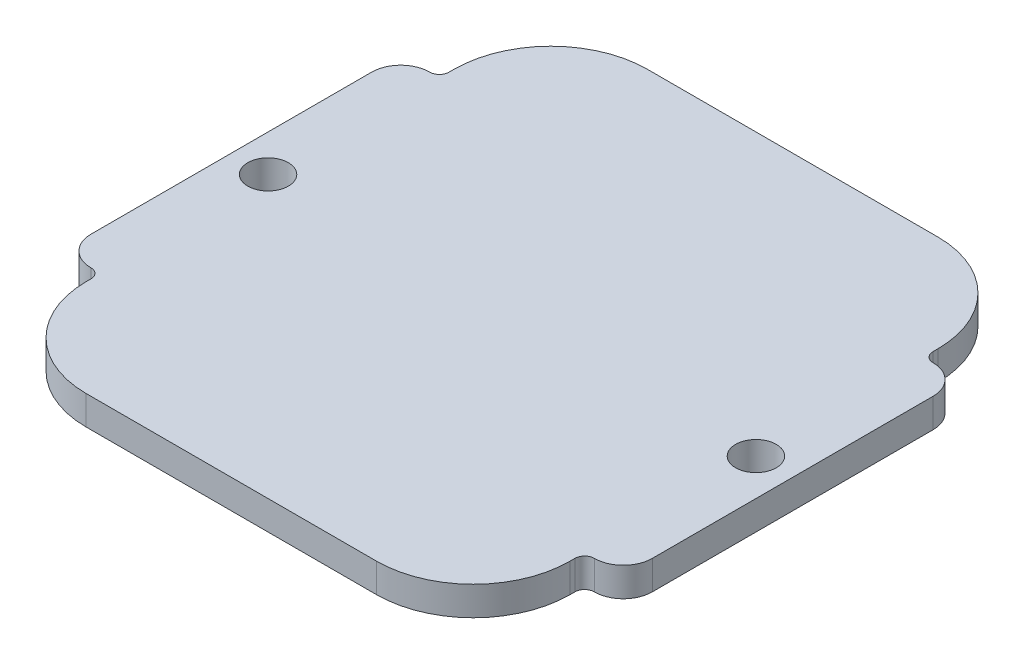
ISO-10303-21;
HEADER;
FILE_DESCRIPTION(('STEP AP214'),'2;1');
FILE_NAME('part.step','',(''),(''),'','','');
FILE_SCHEMA(('AUTOMOTIVE_DESIGN { 1 0 10303 214 1 1 1 1 }'));
ENDSEC;
DATA;
#1=APPLICATION_CONTEXT('core data for automotive mechanical design processes');
#2=APPLICATION_PROTOCOL_DEFINITION('international standard','automotive_design',2000,#1);
#3=PRODUCT_CONTEXT('',#1,'mechanical');
#4=PRODUCT('Part','Part','',(#3));
#5=PRODUCT_RELATED_PRODUCT_CATEGORY('part','',(#4));
#6=PRODUCT_DEFINITION_FORMATION('','',#4);
#7=PRODUCT_DEFINITION_CONTEXT('part definition',#1,'design');
#8=PRODUCT_DEFINITION('design','',#6,#7);
#9=PRODUCT_DEFINITION_SHAPE('','',#8);
#10=(LENGTH_UNIT() NAMED_UNIT(*) SI_UNIT(.MILLI.,.METRE.));
#11=(NAMED_UNIT(*) PLANE_ANGLE_UNIT() SI_UNIT($,.RADIAN.));
#12=(NAMED_UNIT(*) SI_UNIT($,.STERADIAN.) SOLID_ANGLE_UNIT());
#13=UNCERTAINTY_MEASURE_WITH_UNIT(LENGTH_MEASURE(1.E-05),#10,'distance_accuracy_value','');
#14=(GEOMETRIC_REPRESENTATION_CONTEXT(3) GLOBAL_UNCERTAINTY_ASSIGNED_CONTEXT((#13)) GLOBAL_UNIT_ASSIGNED_CONTEXT((#10,
#11,#12)) REPRESENTATION_CONTEXT('',''));
#15=CARTESIAN_POINT('',(0.,0.,0.));
#16=DIRECTION('',(0.,0.,1.));
#17=DIRECTION('',(1.,0.,0.));
#18=AXIS2_PLACEMENT_3D('',#15,#16,#17);
#19=CARTESIAN_POINT('',(28.9999999999999,3.,-17.4999999999996));
#20=DIRECTION('',(-1.,0.,0.));
#21=DIRECTION('',(0.,0.,1.));
#22=AXIS2_PLACEMENT_3D('',#19,#20,#21);
#23=PLANE('',#22);
#24=DIRECTION('',(0.,0.,-1.));
#25=VECTOR('',#24,1.);
#26=CARTESIAN_POINT('',(28.9999999999999,3.,-17.4999999999996));
#27=LINE('',#26,#25);
#28=CARTESIAN_POINT('',(28.9999999999999,3.,14.5000000000004));
#29=VERTEX_POINT('',#28);
#30=CARTESIAN_POINT('',(28.9999999999999,3.,-14.4999999999996));
#31=VERTEX_POINT('',#30);
#32=EDGE_CURVE('E214',#29,#31,#27,.T.);
#33=ORIENTED_EDGE('',*,*,#32,.F.);
#34=DIRECTION('',(0.,-1.,0.));
#35=VECTOR('',#34,1.);
#36=CARTESIAN_POINT('',(28.9999999999999,3.,14.5000000000004));
#37=LINE('',#36,#35);
#38=CARTESIAN_POINT('',(28.9999999999999,0.,14.5000000000004));
#39=VERTEX_POINT('',#38);
#40=EDGE_CURVE('E287',#29,#39,#37,.T.);
#41=ORIENTED_EDGE('',*,*,#40,.T.);
#42=DIRECTION('',(0.,0.,-1.));
#43=VECTOR('',#42,1.);
#44=CARTESIAN_POINT('',(28.9999999999999,0.,-17.4999999999996));
#45=LINE('',#44,#43);
#46=CARTESIAN_POINT('',(28.9999999999999,0.,-14.4999999999996));
#47=VERTEX_POINT('',#46);
#48=EDGE_CURVE('E201',#39,#47,#45,.T.);
#49=ORIENTED_EDGE('',*,*,#48,.T.);
#50=DIRECTION('',(0.,-1.,0.));
#51=VECTOR('',#50,1.);
#52=CARTESIAN_POINT('',(28.9999999999999,3.,-14.4999999999996));
#53=LINE('',#52,#51);
#54=EDGE_CURVE('E285',#47,#31,#53,.F.);
#55=ORIENTED_EDGE('',*,*,#54,.T.);
#56=EDGE_LOOP('',(#33,#41,#49,#55));
#57=FACE_BOUND('',#56,.T.);
#58=ADVANCED_FACE('F32',(#57),#23,.F.);
#59=CARTESIAN_POINT('',(24.9999999999999,3.,-17.4999999999996));
#60=DIRECTION('',(-1.,0.,0.));
#61=DIRECTION('',(0.,0.,1.));
#62=AXIS2_PLACEMENT_3D('',#59,#60,#61);
#63=PLANE('',#62);
#64=DIRECTION('',(0.,0.,-1.));
#65=VECTOR('',#64,1.);
#66=CARTESIAN_POINT('',(24.9999999999999,3.,-17.4999999999996));
#67=LINE('',#66,#65);
#68=CARTESIAN_POINT('',(24.9999999999999,3.,-18.4999999999996));
#69=VERTEX_POINT('',#68);
#70=CARTESIAN_POINT('',(24.9999999999999,3.,-18.9999999999995));
#71=VERTEX_POINT('',#70);
#72=EDGE_CURVE('E363',#69,#71,#67,.T.);
#73=ORIENTED_EDGE('',*,*,#72,.F.);
#74=DIRECTION('',(0.,-1.,0.));
#75=VECTOR('',#74,1.);
#76=CARTESIAN_POINT('',(24.9999999999999,0.,-18.4999999999996));
#77=LINE('',#76,#75);
#78=CARTESIAN_POINT('',(24.9999999999999,0.,-18.4999999999996));
#79=VERTEX_POINT('',#78);
#80=EDGE_CURVE('E256',#69,#79,#77,.T.);
#81=ORIENTED_EDGE('',*,*,#80,.T.);
#82=DIRECTION('',(0.,0.,-1.));
#83=VECTOR('',#82,1.);
#84=CARTESIAN_POINT('',(24.9999999999999,0.,-17.4999999999996));
#85=LINE('',#84,#83);
#86=CARTESIAN_POINT('',(24.9999999999999,0.,-18.9999999999995));
#87=VERTEX_POINT('',#86);
#88=EDGE_CURVE('E196',#79,#87,#85,.T.);
#89=ORIENTED_EDGE('',*,*,#88,.T.);
#90=DIRECTION('',(0.,-1.,0.));
#91=VECTOR('',#90,1.);
#92=CARTESIAN_POINT('',(24.9999999999999,3.,-18.9999999999995));
#93=LINE('',#92,#91);
#94=EDGE_CURVE('E175',#87,#71,#93,.F.);
#95=ORIENTED_EDGE('',*,*,#94,.T.);
#96=EDGE_LOOP('',(#73,#81,#89,#95));
#97=FACE_BOUND('',#96,.T.);
#98=ADVANCED_FACE('F388',(#97),#63,.F.);
#99=CARTESIAN_POINT('',(-24.9999999999999,3.,-28.9999999999995));
#100=DIRECTION('',(0.,0.,1.));
#101=DIRECTION('',(1.,0.,0.));
#102=AXIS2_PLACEMENT_3D('',#99,#100,#101);
#103=PLANE('',#102);
#104=DIRECTION('',(-1.,0.,0.));
#105=VECTOR('',#104,1.);
#106=CARTESIAN_POINT('',(-24.9999999999999,3.,-28.9999999999995));
#107=LINE('',#106,#105);
#108=CARTESIAN_POINT('',(14.9999999999999,3.,-28.9999999999995));
#109=VERTEX_POINT('',#108);
#110=CARTESIAN_POINT('',(-15.0000000000001,3.,-28.9999999999995));
#111=VERTEX_POINT('',#110);
#112=EDGE_CURVE('E188',#109,#111,#107,.T.);
#113=ORIENTED_EDGE('',*,*,#112,.F.);
#114=DIRECTION('',(0.,-1.,0.));
#115=VECTOR('',#114,1.);
#116=CARTESIAN_POINT('',(14.9999999999999,3.,-28.9999999999995));
#117=LINE('',#116,#115);
#118=CARTESIAN_POINT('',(14.9999999999999,0.,-28.9999999999995));
#119=VERTEX_POINT('',#118);
#120=EDGE_CURVE('E173',#109,#119,#117,.T.);
#121=ORIENTED_EDGE('',*,*,#120,.T.);
#122=DIRECTION('',(-1.,0.,0.));
#123=VECTOR('',#122,1.);
#124=CARTESIAN_POINT('',(-24.9999999999999,0.,-28.9999999999995));
#125=LINE('',#124,#123);
#126=CARTESIAN_POINT('',(-15.0000000000001,0.,-28.9999999999995));
#127=VERTEX_POINT('',#126);
#128=EDGE_CURVE('E185',#119,#127,#125,.T.);
#129=ORIENTED_EDGE('',*,*,#128,.T.);
#130=DIRECTION('',(0.,-1.,0.));
#131=VECTOR('',#130,1.);
#132=CARTESIAN_POINT('',(-15.0000000000001,3.,-28.9999999999995));
#133=LINE('',#132,#131);
#134=EDGE_CURVE('E190',#127,#111,#133,.F.);
#135=ORIENTED_EDGE('',*,*,#134,.T.);
#136=EDGE_LOOP('',(#113,#121,#129,#135));
#137=FACE_BOUND('',#136,.T.);
#138=ADVANCED_FACE('F184',(#137),#103,.F.);
#139=CARTESIAN_POINT('',(-25.0000000000001,3.,-17.4999999999995));
#140=DIRECTION('',(1.,0.,0.));
#141=DIRECTION('',(0.,0.,-1.));
#142=AXIS2_PLACEMENT_3D('',#139,#140,#141);
#143=PLANE('',#142);
#144=DIRECTION('',(0.,0.,1.));
#145=VECTOR('',#144,1.);
#146=CARTESIAN_POINT('',(-25.0000000000001,0.,-17.4999999999995));
#147=LINE('',#146,#145);
#148=CARTESIAN_POINT('',(-25.0000000000001,0.,-18.9999999999997));
#149=VERTEX_POINT('',#148);
#150=CARTESIAN_POINT('',(-25.0000000000001,0.,-18.4999999999995));
#151=VERTEX_POINT('',#150);
#152=EDGE_CURVE('E195',#149,#151,#147,.T.);
#153=ORIENTED_EDGE('',*,*,#152,.T.);
#154=DIRECTION('',(0.,-1.,0.));
#155=VECTOR('',#154,1.);
#156=CARTESIAN_POINT('',(-25.0000000000001,3.,-18.4999999999995));
#157=LINE('',#156,#155);
#158=CARTESIAN_POINT('',(-25.0000000000001,3.,-18.4999999999995));
#159=VERTEX_POINT('',#158);
#160=EDGE_CURVE('E265',#151,#159,#157,.F.);
#161=ORIENTED_EDGE('',*,*,#160,.T.);
#162=DIRECTION('',(0.,0.,1.));
#163=VECTOR('',#162,1.);
#164=CARTESIAN_POINT('',(-25.0000000000001,3.,-17.4999999999995));
#165=LINE('',#164,#163);
#166=CARTESIAN_POINT('',(-25.0000000000001,3.,-18.9999999999997));
#167=VERTEX_POINT('',#166);
#168=EDGE_CURVE('E366',#167,#159,#165,.T.);
#169=ORIENTED_EDGE('',*,*,#168,.F.);
#170=DIRECTION('',(0.,-1.,0.));
#171=VECTOR('',#170,1.);
#172=CARTESIAN_POINT('',(-25.0000000000001,3.,-18.9999999999997));
#173=LINE('',#172,#171);
#174=EDGE_CURVE('E242',#167,#149,#173,.T.);
#175=ORIENTED_EDGE('',*,*,#174,.T.);
#176=EDGE_LOOP('',(#153,#161,#169,#175));
#177=FACE_BOUND('',#176,.T.);
#178=ADVANCED_FACE('F461',(#177),#143,.F.);
#179=CARTESIAN_POINT('',(-29.0000000000001,3.,-17.4999999999995));
#180=DIRECTION('',(1.,0.,0.));
#181=DIRECTION('',(0.,0.,-1.));
#182=AXIS2_PLACEMENT_3D('',#179,#180,#181);
#183=PLANE('',#182);
#184=DIRECTION('',(0.,0.,1.));
#185=VECTOR('',#184,1.);
#186=CARTESIAN_POINT('',(-29.0000000000001,0.,-17.4999999999995));
#187=LINE('',#186,#185);
#188=CARTESIAN_POINT('',(-29.0000000000001,0.,-14.4999999999995));
#189=VERTEX_POINT('',#188);
#190=CARTESIAN_POINT('',(-29.0000000000001,0.,14.5000000000005));
#191=VERTEX_POINT('',#190);
#192=EDGE_CURVE('E199',#189,#191,#187,.T.);
#193=ORIENTED_EDGE('',*,*,#192,.T.);
#194=DIRECTION('',(0.,-1.,0.));
#195=VECTOR('',#194,1.);
#196=CARTESIAN_POINT('',(-29.0000000000001,3.,14.5000000000005));
#197=LINE('',#196,#195);
#198=CARTESIAN_POINT('',(-29.0000000000001,3.,14.5000000000005));
#199=VERTEX_POINT('',#198);
#200=EDGE_CURVE('E11',#191,#199,#197,.F.);
#201=ORIENTED_EDGE('',*,*,#200,.T.);
#202=DIRECTION('',(0.,0.,1.));
#203=VECTOR('',#202,1.);
#204=CARTESIAN_POINT('',(-29.0000000000001,3.,-17.4999999999995));
#205=LINE('',#204,#203);
#206=CARTESIAN_POINT('',(-29.0000000000001,3.,-14.4999999999995));
#207=VERTEX_POINT('',#206);
#208=EDGE_CURVE('E308',#207,#199,#205,.T.);
#209=ORIENTED_EDGE('',*,*,#208,.F.);
#210=DIRECTION('',(0.,-1.,0.));
#211=VECTOR('',#210,1.);
#212=CARTESIAN_POINT('',(-29.0000000000001,3.,-14.4999999999995));
#213=LINE('',#212,#211);
#214=EDGE_CURVE('E40',#207,#189,#213,.T.);
#215=ORIENTED_EDGE('',*,*,#214,.T.);
#216=EDGE_LOOP('',(#193,#201,#209,#215));
#217=FACE_BOUND('',#216,.T.);
#218=ADVANCED_FACE('F307',(#217),#183,.F.);
#219=CARTESIAN_POINT('',(-25.0000000000001,3.,17.5000000000005));
#220=DIRECTION('',(1.,0.,0.));
#221=DIRECTION('',(0.,0.,-1.));
#222=AXIS2_PLACEMENT_3D('',#219,#220,#221);
#223=PLANE('',#222);
#224=DIRECTION('',(0.,0.,1.));
#225=VECTOR('',#224,1.);
#226=CARTESIAN_POINT('',(-25.0000000000001,3.,17.5000000000005));
#227=LINE('',#226,#225);
#228=CARTESIAN_POINT('',(-25.0000000000001,3.,18.5000000000004));
#229=VERTEX_POINT('',#228);
#230=CARTESIAN_POINT('',(-25.0000000000001,3.,19.0000000000006));
#231=VERTEX_POINT('',#230);
#232=EDGE_CURVE('E324',#229,#231,#227,.T.);
#233=ORIENTED_EDGE('',*,*,#232,.F.);
#234=DIRECTION('',(0.,-1.,0.));
#235=VECTOR('',#234,1.);
#236=CARTESIAN_POINT('',(-25.0000000000001,0.,18.5000000000004));
#237=LINE('',#236,#235);
#238=CARTESIAN_POINT('',(-25.0000000000001,0.,18.5000000000004));
#239=VERTEX_POINT('',#238);
#240=EDGE_CURVE('E245',#229,#239,#237,.T.);
#241=ORIENTED_EDGE('',*,*,#240,.T.);
#242=DIRECTION('',(0.,0.,1.));
#243=VECTOR('',#242,1.);
#244=CARTESIAN_POINT('',(-25.0000000000001,0.,17.5000000000005));
#245=LINE('',#244,#243);
#246=CARTESIAN_POINT('',(-25.0000000000001,0.,19.0000000000006));
#247=VERTEX_POINT('',#246);
#248=EDGE_CURVE('E206',#239,#247,#245,.T.);
#249=ORIENTED_EDGE('',*,*,#248,.T.);
#250=DIRECTION('',(0.,-1.,0.));
#251=VECTOR('',#250,1.);
#252=CARTESIAN_POINT('',(-25.0000000000001,3.,19.0000000000006));
#253=LINE('',#252,#251);
#254=EDGE_CURVE('E239',#247,#231,#253,.F.);
#255=ORIENTED_EDGE('',*,*,#254,.T.);
#256=EDGE_LOOP('',(#233,#241,#249,#255));
#257=FACE_BOUND('',#256,.T.);
#258=ADVANCED_FACE('F323',(#257),#223,.F.);
#259=CARTESIAN_POINT('',(-24.9999999999999,3.,29.0000000000004));
#260=DIRECTION('',(0.,0.,-1.));
#261=DIRECTION('',(-1.,0.,0.));
#262=AXIS2_PLACEMENT_3D('',#259,#260,#261);
#263=PLANE('',#262);
#264=DIRECTION('',(1.,0.,0.));
#265=VECTOR('',#264,1.);
#266=CARTESIAN_POINT('',(-24.9999999999999,0.,29.0000000000004));
#267=LINE('',#266,#265);
#268=CARTESIAN_POINT('',(-15.0000000000001,0.,29.0000000000004));
#269=VERTEX_POINT('',#268);
#270=CARTESIAN_POINT('',(14.9999999999999,0.,29.0000000000005));
#271=VERTEX_POINT('',#270);
#272=EDGE_CURVE('E208',#269,#271,#267,.T.);
#273=ORIENTED_EDGE('',*,*,#272,.T.);
#274=DIRECTION('',(0.,-1.,0.));
#275=VECTOR('',#274,1.);
#276=CARTESIAN_POINT('',(14.9999999999999,3.,29.0000000000005));
#277=LINE('',#276,#275);
#278=CARTESIAN_POINT('',(14.9999999999999,3.,29.0000000000005));
#279=VERTEX_POINT('',#278);
#280=EDGE_CURVE('E237',#271,#279,#277,.F.);
#281=ORIENTED_EDGE('',*,*,#280,.T.);
#282=DIRECTION('',(1.,0.,0.));
#283=VECTOR('',#282,1.);
#284=CARTESIAN_POINT('',(-24.9999999999999,3.,29.0000000000004));
#285=LINE('',#284,#283);
#286=CARTESIAN_POINT('',(-15.0000000000001,3.,29.0000000000004));
#287=VERTEX_POINT('',#286);
#288=EDGE_CURVE('E333',#287,#279,#285,.T.);
#289=ORIENTED_EDGE('',*,*,#288,.F.);
#290=DIRECTION('',(0.,-1.,0.));
#291=VECTOR('',#290,1.);
#292=CARTESIAN_POINT('',(-15.0000000000001,3.,29.0000000000004));
#293=LINE('',#292,#291);
#294=EDGE_CURVE('E234',#287,#269,#293,.T.);
#295=ORIENTED_EDGE('',*,*,#294,.T.);
#296=EDGE_LOOP('',(#273,#281,#289,#295));
#297=FACE_BOUND('',#296,.T.);
#298=ADVANCED_FACE('F336',(#297),#263,.F.);
#299=CARTESIAN_POINT('',(24.9999999999999,3.,17.5000000000005));
#300=DIRECTION('',(-1.,0.,0.));
#301=DIRECTION('',(0.,0.,1.));
#302=AXIS2_PLACEMENT_3D('',#299,#300,#301);
#303=PLANE('',#302);
#304=DIRECTION('',(0.,0.,-1.));
#305=VECTOR('',#304,1.);
#306=CARTESIAN_POINT('',(24.9999999999999,0.,17.5000000000005));
#307=LINE('',#306,#305);
#308=CARTESIAN_POINT('',(24.9999999999999,0.,19.0000000000004));
#309=VERTEX_POINT('',#308);
#310=CARTESIAN_POINT('',(24.9999999999999,0.,18.5000000000005));
#311=VERTEX_POINT('',#310);
#312=EDGE_CURVE('E211',#309,#311,#307,.T.);
#313=ORIENTED_EDGE('',*,*,#312,.T.);
#314=DIRECTION('',(0.,-1.,0.));
#315=VECTOR('',#314,1.);
#316=CARTESIAN_POINT('',(24.9999999999999,3.,18.5000000000005));
#317=LINE('',#316,#315);
#318=CARTESIAN_POINT('',(24.9999999999999,3.,18.5000000000005));
#319=VERTEX_POINT('',#318);
#320=EDGE_CURVE('E254',#311,#319,#317,.F.);
#321=ORIENTED_EDGE('',*,*,#320,.T.);
#322=DIRECTION('',(0.,0.,-1.));
#323=VECTOR('',#322,1.);
#324=CARTESIAN_POINT('',(24.9999999999999,3.,17.5000000000005));
#325=LINE('',#324,#323);
#326=CARTESIAN_POINT('',(24.9999999999999,3.,19.0000000000004));
#327=VERTEX_POINT('',#326);
#328=EDGE_CURVE('E215',#327,#319,#325,.T.);
#329=ORIENTED_EDGE('',*,*,#328,.F.);
#330=DIRECTION('',(0.,-1.,0.));
#331=VECTOR('',#330,1.);
#332=CARTESIAN_POINT('',(24.9999999999999,3.,19.0000000000004));
#333=LINE('',#332,#331);
#334=EDGE_CURVE('E231',#327,#309,#333,.T.);
#335=ORIENTED_EDGE('',*,*,#334,.T.);
#336=EDGE_LOOP('',(#313,#321,#329,#335));
#337=FACE_BOUND('',#336,.T.);
#338=ADVANCED_FACE('F445',(#337),#303,.F.);
#339=CARTESIAN_POINT('',(0.,3.,0.));
#340=DIRECTION('',(0.,-1.,0.));
#341=DIRECTION('',(0.,0.,-1.));
#342=AXIS2_PLACEMENT_3D('',#339,#340,#341);
#343=PLANE('',#342);
#344=CARTESIAN_POINT('',(-25.2000000000001,3.,0.));
#345=DIRECTION('',(0.,1.,0.));
#346=DIRECTION('',(0.,0.,1.));
#347=AXIS2_PLACEMENT_3D('',#344,#345,#346);
#348=CIRCLE('',#347,2.1);
#349=CARTESIAN_POINT('',(-25.2000000000001,3.,2.1));
#350=VERTEX_POINT('',#349);
#351=EDGE_CURVE('E348',#350,#350,#348,.T.);
#352=ORIENTED_EDGE('',*,*,#351,.F.);
#353=EDGE_LOOP('',(#352));
#354=FACE_BOUND('',#353,.T.);
#355=CARTESIAN_POINT('',(25.1999999999999,3.,0.));
#356=DIRECTION('',(0.,1.,0.));
#357=DIRECTION('',(0.,0.,1.));
#358=AXIS2_PLACEMENT_3D('',#355,#356,#357);
#359=CIRCLE('',#358,2.1);
#360=CARTESIAN_POINT('',(25.1999999999999,3.,2.1));
#361=VERTEX_POINT('',#360);
#362=EDGE_CURVE('E358',#361,#361,#359,.T.);
#363=ORIENTED_EDGE('',*,*,#362,.F.);
#364=EDGE_LOOP('',(#363));
#365=FACE_BOUND('',#364,.T.);
#366=CARTESIAN_POINT('',(25.9999999999999,3.,18.5000000000005));
#367=DIRECTION('',(0.,-1.,0.));
#368=DIRECTION('',(0.,0.,-1.));
#369=AXIS2_PLACEMENT_3D('',#366,#367,#368);
#370=CIRCLE('',#369,1.);
#371=CARTESIAN_POINT('',(25.9999999999999,3.,17.5000000000005));
#372=VERTEX_POINT('',#371);
#373=EDGE_CURVE('E274',#319,#372,#370,.T.);
#374=ORIENTED_EDGE('',*,*,#373,.T.);
#375=CARTESIAN_POINT('',(25.9999999999999,3.,14.5000000000004));
#376=DIRECTION('',(0.,-1.,0.));
#377=DIRECTION('',(0.,0.,-1.));
#378=AXIS2_PLACEMENT_3D('',#375,#376,#377);
#379=CIRCLE('',#378,3.);
#380=EDGE_CURVE('E303',#372,#29,#379,.F.);
#381=ORIENTED_EDGE('',*,*,#380,.T.);
#382=ORIENTED_EDGE('',*,*,#32,.T.);
#383=CARTESIAN_POINT('',(25.9999999999999,3.,-14.4999999999996));
#384=DIRECTION('',(0.,-1.,0.));
#385=DIRECTION('',(0.,0.,-1.));
#386=AXIS2_PLACEMENT_3D('',#383,#384,#385);
#387=CIRCLE('',#386,3.);
#388=CARTESIAN_POINT('',(25.9999999999999,3.,-17.4999999999996));
#389=VERTEX_POINT('',#388);
#390=EDGE_CURVE('E301',#31,#389,#387,.F.);
#391=ORIENTED_EDGE('',*,*,#390,.T.);
#392=CARTESIAN_POINT('',(25.9999999999999,3.,-18.4999999999996));
#393=DIRECTION('',(0.,-1.,0.));
#394=DIRECTION('',(0.,0.,-1.));
#395=AXIS2_PLACEMENT_3D('',#392,#393,#394);
#396=CIRCLE('',#395,1.);
#397=EDGE_CURVE('E279',#389,#69,#396,.T.);
#398=ORIENTED_EDGE('',*,*,#397,.T.);
#399=ORIENTED_EDGE('',*,*,#72,.T.);
#400=CARTESIAN_POINT('',(14.9999999999999,3.,-18.9999999999995));
#401=DIRECTION('',(0.,-1.,0.));
#402=DIRECTION('',(0.,0.,-1.));
#403=AXIS2_PLACEMENT_3D('',#400,#401,#402);
#404=CIRCLE('',#403,10.);
#405=EDGE_CURVE('E229',#71,#109,#404,.F.);
#406=ORIENTED_EDGE('',*,*,#405,.T.);
#407=ORIENTED_EDGE('',*,*,#112,.T.);
#408=CARTESIAN_POINT('',(-15.0000000000001,3.,-18.9999999999995));
#409=DIRECTION('',(0.,-1.,0.));
#410=DIRECTION('',(0.,0.,-1.));
#411=AXIS2_PLACEMENT_3D('',#408,#409,#410);
#412=CIRCLE('',#411,10.);
#413=EDGE_CURVE('E223',#111,#167,#412,.F.);
#414=ORIENTED_EDGE('',*,*,#413,.T.);
#415=ORIENTED_EDGE('',*,*,#168,.T.);
#416=CARTESIAN_POINT('',(-26.0000000000001,3.,-18.4999999999995));
#417=DIRECTION('',(0.,-1.,0.));
#418=DIRECTION('',(0.,0.,-1.));
#419=AXIS2_PLACEMENT_3D('',#416,#417,#418);
#420=CIRCLE('',#419,1.);
#421=CARTESIAN_POINT('',(-26.0000000000001,3.,-17.4999999999995));
#422=VERTEX_POINT('',#421);
#423=EDGE_CURVE('E283',#159,#422,#420,.T.);
#424=ORIENTED_EDGE('',*,*,#423,.T.);
#425=CARTESIAN_POINT('',(-26.0000000000001,3.,-14.4999999999995));
#426=DIRECTION('',(0.,-1.,0.));
#427=DIRECTION('',(0.,0.,-1.));
#428=AXIS2_PLACEMENT_3D('',#425,#426,#427);
#429=CIRCLE('',#428,3.);
#430=EDGE_CURVE('E52',#422,#207,#429,.F.);
#431=ORIENTED_EDGE('',*,*,#430,.T.);
#432=ORIENTED_EDGE('',*,*,#208,.T.);
#433=CARTESIAN_POINT('',(-26.0000000000001,3.,14.5000000000005));
#434=DIRECTION('',(0.,-1.,0.));
#435=DIRECTION('',(0.,0.,-1.));
#436=AXIS2_PLACEMENT_3D('',#433,#434,#435);
#437=CIRCLE('',#436,3.);
#438=CARTESIAN_POINT('',(-26.0000000000001,3.,17.5000000000005));
#439=VERTEX_POINT('',#438);
#440=EDGE_CURVE('E299',#199,#439,#437,.F.);
#441=ORIENTED_EDGE('',*,*,#440,.T.);
#442=CARTESIAN_POINT('',(-26.0000000000001,3.,18.5000000000005));
#443=DIRECTION('',(0.,-1.,0.));
#444=DIRECTION('',(0.,0.,-1.));
#445=AXIS2_PLACEMENT_3D('',#442,#443,#444);
#446=CIRCLE('',#445,1.);
#447=EDGE_CURVE('E270',#439,#229,#446,.T.);
#448=ORIENTED_EDGE('',*,*,#447,.T.);
#449=ORIENTED_EDGE('',*,*,#232,.T.);
#450=CARTESIAN_POINT('',(-15.0000000000001,3.,19.0000000000004));
#451=DIRECTION('',(0.,-1.,0.));
#452=DIRECTION('',(0.,0.,-1.));
#453=AXIS2_PLACEMENT_3D('',#450,#451,#452);
#454=CIRCLE('',#453,10.);
#455=EDGE_CURVE('E225',#231,#287,#454,.F.);
#456=ORIENTED_EDGE('',*,*,#455,.T.);
#457=ORIENTED_EDGE('',*,*,#288,.T.);
#458=CARTESIAN_POINT('',(14.9999999999999,3.,19.0000000000005));
#459=DIRECTION('',(0.,-1.,0.));
#460=DIRECTION('',(0.,0.,-1.));
#461=AXIS2_PLACEMENT_3D('',#458,#459,#460);
#462=CIRCLE('',#461,10.);
#463=EDGE_CURVE('E227',#279,#327,#462,.F.);
#464=ORIENTED_EDGE('',*,*,#463,.T.);
#465=ORIENTED_EDGE('',*,*,#328,.T.);
#466=EDGE_LOOP('',(#374,#381,#382,#391,#398,#399,#406,#407,#414,#415,#424,#431,#432,#441,#448,
#449,#456,#457,#464,#465));
#467=FACE_BOUND('',#466,.T.);
#468=ADVANCED_FACE('F317',(#354,#365,#467),#343,.F.);
#469=CARTESIAN_POINT('',(0.,0.,0.));
#470=DIRECTION('',(0.,-1.,0.));
#471=DIRECTION('',(0.,0.,-1.));
#472=AXIS2_PLACEMENT_3D('',#469,#470,#471);
#473=PLANE('',#472);
#474=CARTESIAN_POINT('',(-25.2000000000001,0.,0.));
#475=DIRECTION('',(0.,1.,0.));
#476=DIRECTION('',(0.,0.,1.));
#477=AXIS2_PLACEMENT_3D('',#474,#475,#476);
#478=CIRCLE('',#477,2.1);
#479=CARTESIAN_POINT('',(-25.2000000000001,0.,2.1));
#480=VERTEX_POINT('',#479);
#481=EDGE_CURVE('E344',#480,#480,#478,.T.);
#482=ORIENTED_EDGE('',*,*,#481,.T.);
#483=EDGE_LOOP('',(#482));
#484=FACE_BOUND('',#483,.T.);
#485=CARTESIAN_POINT('',(25.1999999999999,0.,0.));
#486=DIRECTION('',(0.,1.,0.));
#487=DIRECTION('',(0.,0.,1.));
#488=AXIS2_PLACEMENT_3D('',#485,#486,#487);
#489=CIRCLE('',#488,2.1);
#490=CARTESIAN_POINT('',(25.1999999999999,0.,2.1));
#491=VERTEX_POINT('',#490);
#492=EDGE_CURVE('E353',#491,#491,#489,.T.);
#493=ORIENTED_EDGE('',*,*,#492,.T.);
#494=EDGE_LOOP('',(#493));
#495=FACE_BOUND('',#494,.T.);
#496=ORIENTED_EDGE('',*,*,#48,.F.);
#497=CARTESIAN_POINT('',(25.9999999999999,0.,14.5000000000004));
#498=DIRECTION('',(0.,-1.,0.));
#499=DIRECTION('',(0.,0.,-1.));
#500=AXIS2_PLACEMENT_3D('',#497,#498,#499);
#501=CIRCLE('',#500,3.);
#502=CARTESIAN_POINT('',(25.9999999999999,0.,17.5000000000005));
#503=VERTEX_POINT('',#502);
#504=EDGE_CURVE('E296',#39,#503,#501,.T.);
#505=ORIENTED_EDGE('',*,*,#504,.T.);
#506=CARTESIAN_POINT('',(25.9999999999999,0.,18.5000000000005));
#507=DIRECTION('',(0.,-1.,0.));
#508=DIRECTION('',(0.,0.,-1.));
#509=AXIS2_PLACEMENT_3D('',#506,#507,#508);
#510=CIRCLE('',#509,1.);
#511=EDGE_CURVE('E272',#503,#311,#510,.F.);
#512=ORIENTED_EDGE('',*,*,#511,.T.);
#513=ORIENTED_EDGE('',*,*,#312,.F.);
#514=CARTESIAN_POINT('',(14.9999999999999,0.,19.0000000000005));
#515=DIRECTION('',(0.,-1.,0.));
#516=DIRECTION('',(0.,0.,-1.));
#517=AXIS2_PLACEMENT_3D('',#514,#515,#516);
#518=CIRCLE('',#517,10.);
#519=EDGE_CURVE('E179',#309,#271,#518,.T.);
#520=ORIENTED_EDGE('',*,*,#519,.T.);
#521=ORIENTED_EDGE('',*,*,#272,.F.);
#522=CARTESIAN_POINT('',(-15.0000000000001,0.,19.0000000000004));
#523=DIRECTION('',(0.,-1.,0.));
#524=DIRECTION('',(0.,0.,-1.));
#525=AXIS2_PLACEMENT_3D('',#522,#523,#524);
#526=CIRCLE('',#525,10.);
#527=EDGE_CURVE('E218',#269,#247,#526,.T.);
#528=ORIENTED_EDGE('',*,*,#527,.T.);
#529=ORIENTED_EDGE('',*,*,#248,.F.);
#530=CARTESIAN_POINT('',(-26.0000000000001,0.,18.5000000000005));
#531=DIRECTION('',(0.,-1.,0.));
#532=DIRECTION('',(0.,0.,-1.));
#533=AXIS2_PLACEMENT_3D('',#530,#531,#532);
#534=CIRCLE('',#533,1.);
#535=CARTESIAN_POINT('',(-26.0000000000001,0.,17.5000000000005));
#536=VERTEX_POINT('',#535);
#537=EDGE_CURVE('E267',#239,#536,#534,.F.);
#538=ORIENTED_EDGE('',*,*,#537,.T.);
#539=CARTESIAN_POINT('',(-26.0000000000001,0.,14.5000000000005));
#540=DIRECTION('',(0.,-1.,0.));
#541=DIRECTION('',(0.,0.,-1.));
#542=AXIS2_PLACEMENT_3D('',#539,#540,#541);
#543=CIRCLE('',#542,3.);
#544=EDGE_CURVE('E292',#536,#191,#543,.T.);
#545=ORIENTED_EDGE('',*,*,#544,.T.);
#546=ORIENTED_EDGE('',*,*,#192,.F.);
#547=CARTESIAN_POINT('',(-26.0000000000001,0.,-14.4999999999995));
#548=DIRECTION('',(0.,-1.,0.));
#549=DIRECTION('',(0.,0.,-1.));
#550=AXIS2_PLACEMENT_3D('',#547,#548,#549);
#551=CIRCLE('',#550,3.);
#552=CARTESIAN_POINT('',(-26.0000000000001,0.,-17.4999999999995));
#553=VERTEX_POINT('',#552);
#554=EDGE_CURVE('E290',#189,#553,#551,.T.);
#555=ORIENTED_EDGE('',*,*,#554,.T.);
#556=CARTESIAN_POINT('',(-26.0000000000001,0.,-18.4999999999995));
#557=DIRECTION('',(0.,-1.,0.));
#558=DIRECTION('',(0.,0.,-1.));
#559=AXIS2_PLACEMENT_3D('',#556,#557,#558);
#560=CIRCLE('',#559,1.);
#561=EDGE_CURVE('E281',#553,#151,#560,.F.);
#562=ORIENTED_EDGE('',*,*,#561,.T.);
#563=ORIENTED_EDGE('',*,*,#152,.F.);
#564=CARTESIAN_POINT('',(-15.0000000000001,0.,-18.9999999999995));
#565=DIRECTION('',(0.,-1.,0.));
#566=DIRECTION('',(0.,0.,-1.));
#567=AXIS2_PLACEMENT_3D('',#564,#565,#566);
#568=CIRCLE('',#567,10.);
#569=EDGE_CURVE('E189',#149,#127,#568,.T.);
#570=ORIENTED_EDGE('',*,*,#569,.T.);
#571=ORIENTED_EDGE('',*,*,#128,.F.);
#572=CARTESIAN_POINT('',(14.9999999999999,0.,-18.9999999999995));
#573=DIRECTION('',(0.,-1.,0.));
#574=DIRECTION('',(0.,0.,-1.));
#575=AXIS2_PLACEMENT_3D('',#572,#573,#574);
#576=CIRCLE('',#575,10.);
#577=EDGE_CURVE('E169',#119,#87,#576,.T.);
#578=ORIENTED_EDGE('',*,*,#577,.T.);
#579=ORIENTED_EDGE('',*,*,#88,.F.);
#580=CARTESIAN_POINT('',(25.9999999999999,0.,-18.4999999999996));
#581=DIRECTION('',(0.,-1.,0.));
#582=DIRECTION('',(0.,0.,-1.));
#583=AXIS2_PLACEMENT_3D('',#580,#581,#582);
#584=CIRCLE('',#583,1.);
#585=CARTESIAN_POINT('',(25.9999999999999,0.,-17.4999999999996));
#586=VERTEX_POINT('',#585);
#587=EDGE_CURVE('E276',#79,#586,#584,.F.);
#588=ORIENTED_EDGE('',*,*,#587,.T.);
#589=CARTESIAN_POINT('',(25.9999999999999,0.,-14.4999999999996));
#590=DIRECTION('',(0.,-1.,0.));
#591=DIRECTION('',(0.,0.,-1.));
#592=AXIS2_PLACEMENT_3D('',#589,#590,#591);
#593=CIRCLE('',#592,3.);
#594=EDGE_CURVE('E294',#586,#47,#593,.T.);
#595=ORIENTED_EDGE('',*,*,#594,.T.);
#596=EDGE_LOOP('',(#496,#505,#512,#513,#520,#521,#528,#529,#538,#545,#546,#555,#562,#563,#570,
#571,#578,#579,#588,#595));
#597=FACE_BOUND('',#596,.T.);
#598=ADVANCED_FACE('F193',(#484,#495,#597),#473,.T.);
#599=CARTESIAN_POINT('',(14.9999999999999,3.,-18.9999999999995));
#600=DIRECTION('',(0.,-1.,0.));
#601=DIRECTION('',(0.,0.,-1.));
#602=AXIS2_PLACEMENT_3D('',#599,#600,#601);
#603=CYLINDRICAL_SURFACE('',#602,10.);
#604=ORIENTED_EDGE('',*,*,#405,.F.);
#605=ORIENTED_EDGE('',*,*,#94,.F.);
#606=ORIENTED_EDGE('',*,*,#577,.F.);
#607=ORIENTED_EDGE('',*,*,#120,.F.);
#608=EDGE_LOOP('',(#604,#605,#606,#607));
#609=FACE_BOUND('',#608,.T.);
#610=ADVANCED_FACE('F172',(#609),#603,.T.);
#611=CARTESIAN_POINT('',(14.9999999999999,3.,19.0000000000005));
#612=DIRECTION('',(0.,-1.,0.));
#613=DIRECTION('',(0.,0.,-1.));
#614=AXIS2_PLACEMENT_3D('',#611,#612,#613);
#615=CYLINDRICAL_SURFACE('',#614,10.);
#616=ORIENTED_EDGE('',*,*,#463,.F.);
#617=ORIENTED_EDGE('',*,*,#280,.F.);
#618=ORIENTED_EDGE('',*,*,#519,.F.);
#619=ORIENTED_EDGE('',*,*,#334,.F.);
#620=EDGE_LOOP('',(#616,#617,#618,#619));
#621=FACE_BOUND('',#620,.T.);
#622=ADVANCED_FACE('F400',(#621),#615,.T.);
#623=CARTESIAN_POINT('',(-15.0000000000001,3.,19.0000000000004));
#624=DIRECTION('',(0.,-1.,0.));
#625=DIRECTION('',(0.,0.,-1.));
#626=AXIS2_PLACEMENT_3D('',#623,#624,#625);
#627=CYLINDRICAL_SURFACE('',#626,10.);
#628=ORIENTED_EDGE('',*,*,#455,.F.);
#629=ORIENTED_EDGE('',*,*,#254,.F.);
#630=ORIENTED_EDGE('',*,*,#527,.F.);
#631=ORIENTED_EDGE('',*,*,#294,.F.);
#632=EDGE_LOOP('',(#628,#629,#630,#631));
#633=FACE_BOUND('',#632,.T.);
#634=ADVANCED_FACE('F330',(#633),#627,.T.);
#635=CARTESIAN_POINT('',(-15.0000000000001,3.,-18.9999999999995));
#636=DIRECTION('',(0.,-1.,0.));
#637=DIRECTION('',(0.,0.,-1.));
#638=AXIS2_PLACEMENT_3D('',#635,#636,#637);
#639=CYLINDRICAL_SURFACE('',#638,10.);
#640=ORIENTED_EDGE('',*,*,#413,.F.);
#641=ORIENTED_EDGE('',*,*,#134,.F.);
#642=ORIENTED_EDGE('',*,*,#569,.F.);
#643=ORIENTED_EDGE('',*,*,#174,.F.);
#644=EDGE_LOOP('',(#640,#641,#642,#643));
#645=FACE_BOUND('',#644,.T.);
#646=ADVANCED_FACE('F406',(#645),#639,.T.);
#647=CARTESIAN_POINT('',(-26.0000000000001,3.,18.5000000000005));
#648=DIRECTION('',(0.,1.,0.));
#649=DIRECTION('',(0.,0.,1.));
#650=AXIS2_PLACEMENT_3D('',#647,#648,#649);
#651=CYLINDRICAL_SURFACE('',#650,1.);
#652=ORIENTED_EDGE('',*,*,#447,.F.);
#653=DIRECTION('',(0.,-1.,0.));
#654=VECTOR('',#653,1.);
#655=CARTESIAN_POINT('',(-26.0000000000001,3.,17.5000000000005));
#656=LINE('',#655,#654);
#657=EDGE_CURVE('E248',#536,#439,#656,.F.);
#658=ORIENTED_EDGE('',*,*,#657,.F.);
#659=ORIENTED_EDGE('',*,*,#537,.F.);
#660=ORIENTED_EDGE('',*,*,#240,.F.);
#661=EDGE_LOOP('',(#652,#658,#659,#660));
#662=FACE_BOUND('',#661,.T.);
#663=ADVANCED_FACE('F321',(#662),#651,.F.);
#664=CARTESIAN_POINT('',(25.9999999999999,3.,18.5000000000005));
#665=DIRECTION('',(0.,1.,0.));
#666=DIRECTION('',(0.,0.,1.));
#667=AXIS2_PLACEMENT_3D('',#664,#665,#666);
#668=CYLINDRICAL_SURFACE('',#667,1.);
#669=ORIENTED_EDGE('',*,*,#373,.F.);
#670=ORIENTED_EDGE('',*,*,#320,.F.);
#671=ORIENTED_EDGE('',*,*,#511,.F.);
#672=DIRECTION('',(0.,-1.,0.));
#673=VECTOR('',#672,1.);
#674=CARTESIAN_POINT('',(25.9999999999999,0.,17.5000000000005));
#675=LINE('',#674,#673);
#676=EDGE_CURVE('E251',#372,#503,#675,.T.);
#677=ORIENTED_EDGE('',*,*,#676,.F.);
#678=EDGE_LOOP('',(#669,#670,#671,#677));
#679=FACE_BOUND('',#678,.T.);
#680=ADVANCED_FACE('F412',(#679),#668,.F.);
#681=CARTESIAN_POINT('',(25.9999999999999,3.,-18.4999999999996));
#682=DIRECTION('',(0.,1.,0.));
#683=DIRECTION('',(0.,0.,1.));
#684=AXIS2_PLACEMENT_3D('',#681,#682,#683);
#685=CYLINDRICAL_SURFACE('',#684,1.);
#686=ORIENTED_EDGE('',*,*,#397,.F.);
#687=DIRECTION('',(0.,-1.,0.));
#688=VECTOR('',#687,1.);
#689=CARTESIAN_POINT('',(25.9999999999999,3.,-17.4999999999996));
#690=LINE('',#689,#688);
#691=EDGE_CURVE('E259',#586,#389,#690,.F.);
#692=ORIENTED_EDGE('',*,*,#691,.F.);
#693=ORIENTED_EDGE('',*,*,#587,.F.);
#694=ORIENTED_EDGE('',*,*,#80,.F.);
#695=EDGE_LOOP('',(#686,#692,#693,#694));
#696=FACE_BOUND('',#695,.T.);
#697=ADVANCED_FACE('F415',(#696),#685,.F.);
#698=CARTESIAN_POINT('',(-26.0000000000001,3.,-18.4999999999995));
#699=DIRECTION('',(0.,1.,0.));
#700=DIRECTION('',(0.,0.,1.));
#701=AXIS2_PLACEMENT_3D('',#698,#699,#700);
#702=CYLINDRICAL_SURFACE('',#701,1.);
#703=ORIENTED_EDGE('',*,*,#423,.F.);
#704=ORIENTED_EDGE('',*,*,#160,.F.);
#705=ORIENTED_EDGE('',*,*,#561,.F.);
#706=DIRECTION('',(0.,-1.,0.));
#707=VECTOR('',#706,1.);
#708=CARTESIAN_POINT('',(-26.0000000000001,0.,-17.4999999999995));
#709=LINE('',#708,#707);
#710=EDGE_CURVE('E262',#422,#553,#709,.T.);
#711=ORIENTED_EDGE('',*,*,#710,.F.);
#712=EDGE_LOOP('',(#703,#704,#705,#711));
#713=FACE_BOUND('',#712,.T.);
#714=ADVANCED_FACE('F376',(#713),#702,.F.);
#715=CARTESIAN_POINT('',(25.9999999999999,3.,14.5000000000004));
#716=DIRECTION('',(0.,-1.,0.));
#717=DIRECTION('',(0.,0.,-1.));
#718=AXIS2_PLACEMENT_3D('',#715,#716,#717);
#719=CYLINDRICAL_SURFACE('',#718,3.);
#720=ORIENTED_EDGE('',*,*,#380,.F.);
#721=ORIENTED_EDGE('',*,*,#676,.T.);
#722=ORIENTED_EDGE('',*,*,#504,.F.);
#723=ORIENTED_EDGE('',*,*,#40,.F.);
#724=EDGE_LOOP('',(#720,#721,#722,#723));
#725=FACE_BOUND('',#724,.T.);
#726=ADVANCED_FACE('F422',(#725),#719,.T.);
#727=CARTESIAN_POINT('',(25.9999999999999,3.,-14.4999999999996));
#728=DIRECTION('',(0.,-1.,0.));
#729=DIRECTION('',(0.,0.,-1.));
#730=AXIS2_PLACEMENT_3D('',#727,#728,#729);
#731=CYLINDRICAL_SURFACE('',#730,3.);
#732=ORIENTED_EDGE('',*,*,#390,.F.);
#733=ORIENTED_EDGE('',*,*,#54,.F.);
#734=ORIENTED_EDGE('',*,*,#594,.F.);
#735=ORIENTED_EDGE('',*,*,#691,.T.);
#736=EDGE_LOOP('',(#732,#733,#734,#735));
#737=FACE_BOUND('',#736,.T.);
#738=ADVANCED_FACE('F386',(#737),#731,.T.);
#739=CARTESIAN_POINT('',(-26.0000000000001,3.,14.5000000000005));
#740=DIRECTION('',(0.,-1.,0.));
#741=DIRECTION('',(0.,0.,-1.));
#742=AXIS2_PLACEMENT_3D('',#739,#740,#741);
#743=CYLINDRICAL_SURFACE('',#742,3.);
#744=ORIENTED_EDGE('',*,*,#440,.F.);
#745=ORIENTED_EDGE('',*,*,#200,.F.);
#746=ORIENTED_EDGE('',*,*,#544,.F.);
#747=ORIENTED_EDGE('',*,*,#657,.T.);
#748=EDGE_LOOP('',(#744,#745,#746,#747));
#749=FACE_BOUND('',#748,.T.);
#750=ADVANCED_FACE('F315',(#749),#743,.T.);
#751=CARTESIAN_POINT('',(-26.0000000000001,3.,-14.4999999999995));
#752=DIRECTION('',(0.,-1.,0.));
#753=DIRECTION('',(0.,0.,-1.));
#754=AXIS2_PLACEMENT_3D('',#751,#752,#753);
#755=CYLINDRICAL_SURFACE('',#754,3.);
#756=ORIENTED_EDGE('',*,*,#430,.F.);
#757=ORIENTED_EDGE('',*,*,#710,.T.);
#758=ORIENTED_EDGE('',*,*,#554,.F.);
#759=ORIENTED_EDGE('',*,*,#214,.F.);
#760=EDGE_LOOP('',(#756,#757,#758,#759));
#761=FACE_BOUND('',#760,.T.);
#762=ADVANCED_FACE('F34',(#761),#755,.T.);
#763=CARTESIAN_POINT('',(25.1999999999999,0.,0.));
#764=DIRECTION('',(0.,1.,0.));
#765=DIRECTION('',(0.,0.,1.));
#766=AXIS2_PLACEMENT_3D('',#763,#764,#765);
#767=CYLINDRICAL_SURFACE('',#766,2.1);
#768=ORIENTED_EDGE('',*,*,#492,.F.);
#769=EDGE_LOOP('',(#768));
#770=FACE_BOUND('',#769,.T.);
#771=ORIENTED_EDGE('',*,*,#362,.T.);
#772=EDGE_LOOP('',(#771));
#773=FACE_BOUND('',#772,.T.);
#774=ADVANCED_FACE('F378',(#770,#773),#767,.F.);
#775=CARTESIAN_POINT('',(-25.2000000000001,0.,0.));
#776=DIRECTION('',(0.,1.,0.));
#777=DIRECTION('',(0.,0.,1.));
#778=AXIS2_PLACEMENT_3D('',#775,#776,#777);
#779=CYLINDRICAL_SURFACE('',#778,2.1);
#780=ORIENTED_EDGE('',*,*,#481,.F.);
#781=EDGE_LOOP('',(#780));
#782=FACE_BOUND('',#781,.T.);
#783=ORIENTED_EDGE('',*,*,#351,.T.);
#784=EDGE_LOOP('',(#783));
#785=FACE_BOUND('',#784,.T.);
#786=ADVANCED_FACE('F383',(#782,#785),#779,.F.);
#787=CLOSED_SHELL('',(#58,#98,#138,#178,#218,#258,#298,#338,#468,#598,#610,#622,#634,#646,#663,
#680,#697,#714,#726,#738,#750,#762,#774,#786));
#788=MANIFOLD_SOLID_BREP('B2',#787);
#789=ADVANCED_BREP_SHAPE_REPRESENTATION('',(#18,#788),#14);
#790=SHAPE_DEFINITION_REPRESENTATION(#9,#789);
ENDSEC;
END-ISO-10303-21;
